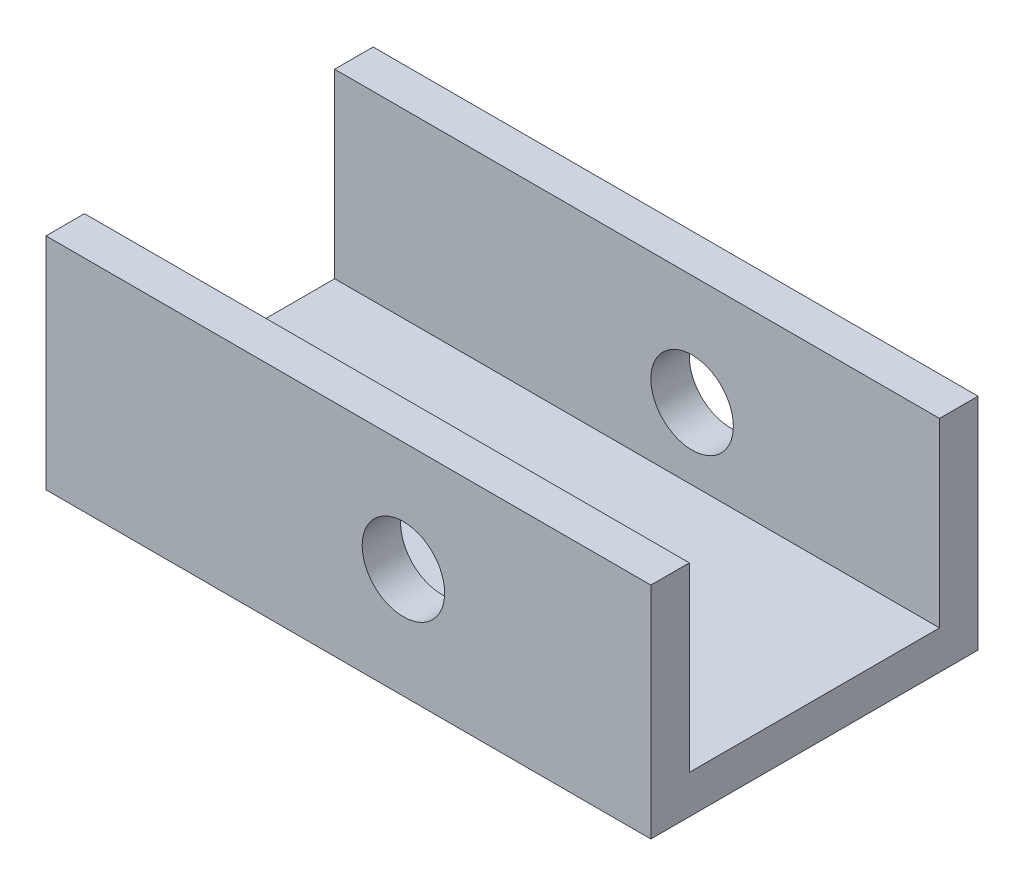
ISO-10303-21;
HEADER;
FILE_DESCRIPTION(('STEP AP214'),'2;1');
FILE_NAME('part.step','',(''),(''),'','','');
FILE_SCHEMA(('AUTOMOTIVE_DESIGN { 1 0 10303 214 1 1 1 1 }'));
ENDSEC;
DATA;
#1=APPLICATION_CONTEXT('core data for automotive mechanical design processes');
#2=APPLICATION_PROTOCOL_DEFINITION('international standard','automotive_design',2000,#1);
#3=PRODUCT_CONTEXT('',#1,'mechanical');
#4=PRODUCT('Part','Part','',(#3));
#5=PRODUCT_RELATED_PRODUCT_CATEGORY('part','',(#4));
#6=PRODUCT_DEFINITION_FORMATION('','',#4);
#7=PRODUCT_DEFINITION_CONTEXT('part definition',#1,'design');
#8=PRODUCT_DEFINITION('design','',#6,#7);
#9=PRODUCT_DEFINITION_SHAPE('','',#8);
#10=(LENGTH_UNIT() NAMED_UNIT(*) SI_UNIT(.MILLI.,.METRE.));
#11=(NAMED_UNIT(*) PLANE_ANGLE_UNIT() SI_UNIT($,.RADIAN.));
#12=(NAMED_UNIT(*) SI_UNIT($,.STERADIAN.) SOLID_ANGLE_UNIT());
#13=UNCERTAINTY_MEASURE_WITH_UNIT(LENGTH_MEASURE(1.E-05),#10,'distance_accuracy_value','');
#14=(GEOMETRIC_REPRESENTATION_CONTEXT(3) GLOBAL_UNCERTAINTY_ASSIGNED_CONTEXT((#13)) GLOBAL_UNIT_ASSIGNED_CONTEXT((#10,
#11,#12)) REPRESENTATION_CONTEXT('',''));
#15=CARTESIAN_POINT('',(0.,0.,0.));
#16=DIRECTION('',(0.,0.,1.));
#17=DIRECTION('',(1.,0.,0.));
#18=AXIS2_PLACEMENT_3D('',#15,#16,#17);
#19=CARTESIAN_POINT('',(0.,1.4,0.));
#20=DIRECTION('',(0.,1.,0.));
#21=DIRECTION('',(0.,0.,1.));
#22=AXIS2_PLACEMENT_3D('',#19,#20,#21);
#23=PLANE('',#22);
#24=DIRECTION('',(0.,0.,-1.));
#25=VECTOR('',#24,1.);
#26=CARTESIAN_POINT('',(0.,1.4,0.));
#27=LINE('',#26,#25);
#28=CARTESIAN_POINT('',(0.,1.4,-1.4));
#29=VERTEX_POINT('',#28);
#30=CARTESIAN_POINT('',(0.,1.4,-10.5));
#31=VERTEX_POINT('',#30);
#32=EDGE_CURVE('E57',#29,#31,#27,.T.);
#33=ORIENTED_EDGE('',*,*,#32,.F.);
#34=DIRECTION('',(1.,0.,0.));
#35=VECTOR('',#34,1.);
#36=CARTESIAN_POINT('',(0.,1.4,-1.4));
#37=LINE('',#36,#35);
#38=CARTESIAN_POINT('',(22.,1.4,-1.4));
#39=VERTEX_POINT('',#38);
#40=EDGE_CURVE('E61',#29,#39,#37,.T.);
#41=ORIENTED_EDGE('',*,*,#40,.T.);
#42=DIRECTION('',(0.,0.,-1.));
#43=VECTOR('',#42,1.);
#44=CARTESIAN_POINT('',(22.,1.4,0.));
#45=LINE('',#44,#43);
#46=CARTESIAN_POINT('',(22.,1.4,-10.5));
#47=VERTEX_POINT('',#46);
#48=EDGE_CURVE('E128',#39,#47,#45,.T.);
#49=ORIENTED_EDGE('',*,*,#48,.T.);
#50=DIRECTION('',(-1.,0.,0.));
#51=VECTOR('',#50,1.);
#52=CARTESIAN_POINT('',(0.,1.4,-10.5));
#53=LINE('',#52,#51);
#54=EDGE_CURVE('E151',#47,#31,#53,.T.);
#55=ORIENTED_EDGE('',*,*,#54,.T.);
#56=EDGE_LOOP('',(#33,#41,#49,#55));
#57=FACE_BOUND('',#56,.T.);
#58=ADVANCED_FACE('F41',(#57),#23,.T.);
#59=CARTESIAN_POINT('',(0.,1.4,0.));
#60=DIRECTION('',(-1.,0.,0.));
#61=DIRECTION('',(0.,0.,1.));
#62=AXIS2_PLACEMENT_3D('',#59,#60,#61);
#63=PLANE('',#62);
#64=DIRECTION('',(0.,-1.,0.));
#65=VECTOR('',#64,1.);
#66=CARTESIAN_POINT('',(0.,1.4,0.));
#67=LINE('',#66,#65);
#68=CARTESIAN_POINT('',(0.,8.,0.));
#69=VERTEX_POINT('',#68);
#70=CARTESIAN_POINT('',(0.,0.,0.));
#71=VERTEX_POINT('',#70);
#72=EDGE_CURVE('E11',#69,#71,#67,.T.);
#73=ORIENTED_EDGE('',*,*,#72,.F.);
#74=DIRECTION('',(0.,0.,-1.));
#75=VECTOR('',#74,1.);
#76=CARTESIAN_POINT('',(0.,8.,0.));
#77=LINE('',#76,#75);
#78=CARTESIAN_POINT('',(0.,8.,-1.4));
#79=VERTEX_POINT('',#78);
#80=EDGE_CURVE('E114',#69,#79,#77,.T.);
#81=ORIENTED_EDGE('',*,*,#80,.T.);
#82=DIRECTION('',(0.,-1.,0.));
#83=VECTOR('',#82,1.);
#84=CARTESIAN_POINT('',(0.,8.,-1.4));
#85=LINE('',#84,#83);
#86=EDGE_CURVE('E110',#79,#29,#85,.T.);
#87=ORIENTED_EDGE('',*,*,#86,.T.);
#88=ORIENTED_EDGE('',*,*,#32,.T.);
#89=DIRECTION('',(0.,-1.,0.));
#90=VECTOR('',#89,1.);
#91=CARTESIAN_POINT('',(0.,8.,-10.5));
#92=LINE('',#91,#90);
#93=CARTESIAN_POINT('',(0.,8.,-10.5));
#94=VERTEX_POINT('',#93);
#95=EDGE_CURVE('E146',#94,#31,#92,.T.);
#96=ORIENTED_EDGE('',*,*,#95,.F.);
#97=DIRECTION('',(0.,0.,-1.));
#98=VECTOR('',#97,1.);
#99=CARTESIAN_POINT('',(0.,8.,0.));
#100=LINE('',#99,#98);
#101=CARTESIAN_POINT('',(0.,8.,-11.9));
#102=VERTEX_POINT('',#101);
#103=EDGE_CURVE('E143',#94,#102,#100,.T.);
#104=ORIENTED_EDGE('',*,*,#103,.T.);
#105=DIRECTION('',(0.,-1.,0.));
#106=VECTOR('',#105,1.);
#107=CARTESIAN_POINT('',(0.,1.4,-11.9));
#108=LINE('',#107,#106);
#109=CARTESIAN_POINT('',(0.,0.,-11.9));
#110=VERTEX_POINT('',#109);
#111=EDGE_CURVE('E157',#102,#110,#108,.T.);
#112=ORIENTED_EDGE('',*,*,#111,.T.);
#113=DIRECTION('',(0.,0.,-1.));
#114=VECTOR('',#113,1.);
#115=CARTESIAN_POINT('',(0.,0.,0.));
#116=LINE('',#115,#114);
#117=EDGE_CURVE('E153',#71,#110,#116,.T.);
#118=ORIENTED_EDGE('',*,*,#117,.F.);
#119=EDGE_LOOP('',(#73,#81,#87,#88,#96,#104,#112,#118));
#120=FACE_BOUND('',#119,.T.);
#121=ADVANCED_FACE('F43',(#120),#63,.T.);
#122=CARTESIAN_POINT('',(0.,1.4,0.));
#123=DIRECTION('',(0.,0.,-1.));
#124=DIRECTION('',(-1.,0.,0.));
#125=AXIS2_PLACEMENT_3D('',#122,#123,#124);
#126=PLANE('',#125);
#127=CARTESIAN_POINT('',(13.,4.,0.));
#128=DIRECTION('',(0.,0.,-1.));
#129=DIRECTION('',(-1.,0.,0.));
#130=AXIS2_PLACEMENT_3D('',#127,#128,#129);
#131=CIRCLE('',#130,1.5);
#132=CARTESIAN_POINT('',(11.5,4.,0.));
#133=VERTEX_POINT('',#132);
#134=EDGE_CURVE('E124',#133,#133,#131,.T.);
#135=ORIENTED_EDGE('',*,*,#134,.T.);
#136=EDGE_LOOP('',(#135));
#137=FACE_BOUND('',#136,.T.);
#138=DIRECTION('',(1.,0.,0.));
#139=VECTOR('',#138,1.);
#140=CARTESIAN_POINT('',(0.,0.,0.));
#141=LINE('',#140,#139);
#142=CARTESIAN_POINT('',(22.,0.,0.));
#143=VERTEX_POINT('',#142);
#144=EDGE_CURVE('E159',#71,#143,#141,.T.);
#145=ORIENTED_EDGE('',*,*,#144,.T.);
#146=DIRECTION('',(0.,-1.,0.));
#147=VECTOR('',#146,1.);
#148=CARTESIAN_POINT('',(22.,1.4,0.));
#149=LINE('',#148,#147);
#150=CARTESIAN_POINT('',(22.,8.,0.));
#151=VERTEX_POINT('',#150);
#152=EDGE_CURVE('E50',#151,#143,#149,.T.);
#153=ORIENTED_EDGE('',*,*,#152,.F.);
#154=DIRECTION('',(1.,0.,0.));
#155=VECTOR('',#154,1.);
#156=CARTESIAN_POINT('',(0.,8.,0.));
#157=LINE('',#156,#155);
#158=EDGE_CURVE('E121',#69,#151,#157,.T.);
#159=ORIENTED_EDGE('',*,*,#158,.F.);
#160=ORIENTED_EDGE('',*,*,#72,.T.);
#161=EDGE_LOOP('',(#145,#153,#159,#160));
#162=FACE_BOUND('',#161,.T.);
#163=ADVANCED_FACE('F193',(#137,#162),#126,.F.);
#164=CARTESIAN_POINT('',(22.,1.4,0.));
#165=DIRECTION('',(-1.,0.,0.));
#166=DIRECTION('',(0.,0.,1.));
#167=AXIS2_PLACEMENT_3D('',#164,#165,#166);
#168=PLANE('',#167);
#169=DIRECTION('',(0.,0.,-1.));
#170=VECTOR('',#169,1.);
#171=CARTESIAN_POINT('',(22.,0.,0.));
#172=LINE('',#171,#170);
#173=CARTESIAN_POINT('',(22.,0.,-11.9));
#174=VERTEX_POINT('',#173);
#175=EDGE_CURVE('E161',#143,#174,#172,.T.);
#176=ORIENTED_EDGE('',*,*,#175,.T.);
#177=DIRECTION('',(0.,-1.,0.));
#178=VECTOR('',#177,1.);
#179=CARTESIAN_POINT('',(22.,1.4,-11.9));
#180=LINE('',#179,#178);
#181=CARTESIAN_POINT('',(22.,8.,-11.9));
#182=VERTEX_POINT('',#181);
#183=EDGE_CURVE('E167',#182,#174,#180,.T.);
#184=ORIENTED_EDGE('',*,*,#183,.F.);
#185=DIRECTION('',(0.,0.,-1.));
#186=VECTOR('',#185,1.);
#187=CARTESIAN_POINT('',(22.,8.,0.));
#188=LINE('',#187,#186);
#189=CARTESIAN_POINT('',(22.,8.,-10.5));
#190=VERTEX_POINT('',#189);
#191=EDGE_CURVE('E137',#190,#182,#188,.T.);
#192=ORIENTED_EDGE('',*,*,#191,.F.);
#193=DIRECTION('',(0.,-1.,0.));
#194=VECTOR('',#193,1.);
#195=CARTESIAN_POINT('',(22.,8.,-10.5));
#196=LINE('',#195,#194);
#197=EDGE_CURVE('E149',#190,#47,#196,.T.);
#198=ORIENTED_EDGE('',*,*,#197,.T.);
#199=ORIENTED_EDGE('',*,*,#48,.F.);
#200=DIRECTION('',(0.,-1.,0.));
#201=VECTOR('',#200,1.);
#202=CARTESIAN_POINT('',(22.,8.,-1.4));
#203=LINE('',#202,#201);
#204=CARTESIAN_POINT('',(22.,8.,-1.4));
#205=VERTEX_POINT('',#204);
#206=EDGE_CURVE('E108',#205,#39,#203,.T.);
#207=ORIENTED_EDGE('',*,*,#206,.F.);
#208=DIRECTION('',(0.,0.,-1.));
#209=VECTOR('',#208,1.);
#210=CARTESIAN_POINT('',(22.,8.,0.));
#211=LINE('',#210,#209);
#212=EDGE_CURVE('E115',#151,#205,#211,.T.);
#213=ORIENTED_EDGE('',*,*,#212,.F.);
#214=ORIENTED_EDGE('',*,*,#152,.T.);
#215=EDGE_LOOP('',(#176,#184,#192,#198,#199,#207,#213,#214));
#216=FACE_BOUND('',#215,.T.);
#217=ADVANCED_FACE('F126',(#216),#168,.F.);
#218=CARTESIAN_POINT('',(0.,1.4,-11.9));
#219=DIRECTION('',(0.,0.,-1.));
#220=DIRECTION('',(-1.,0.,0.));
#221=AXIS2_PLACEMENT_3D('',#218,#219,#220);
#222=PLANE('',#221);
#223=CARTESIAN_POINT('',(13.,4.,-11.9));
#224=DIRECTION('',(0.,0.,1.));
#225=DIRECTION('',(1.,0.,0.));
#226=AXIS2_PLACEMENT_3D('',#223,#224,#225);
#227=CIRCLE('',#226,1.5);
#228=CARTESIAN_POINT('',(14.5,4.,-11.9));
#229=VERTEX_POINT('',#228);
#230=EDGE_CURVE('E216',#229,#229,#227,.T.);
#231=ORIENTED_EDGE('',*,*,#230,.T.);
#232=EDGE_LOOP('',(#231));
#233=FACE_BOUND('',#232,.T.);
#234=DIRECTION('',(1.,0.,0.));
#235=VECTOR('',#234,1.);
#236=CARTESIAN_POINT('',(0.,0.,-11.9));
#237=LINE('',#236,#235);
#238=EDGE_CURVE('E155',#110,#174,#237,.T.);
#239=ORIENTED_EDGE('',*,*,#238,.F.);
#240=ORIENTED_EDGE('',*,*,#111,.F.);
#241=DIRECTION('',(1.,0.,0.));
#242=VECTOR('',#241,1.);
#243=CARTESIAN_POINT('',(0.,8.,-11.9));
#244=LINE('',#243,#242);
#245=EDGE_CURVE('E140',#102,#182,#244,.T.);
#246=ORIENTED_EDGE('',*,*,#245,.T.);
#247=ORIENTED_EDGE('',*,*,#183,.T.);
#248=EDGE_LOOP('',(#239,#240,#246,#247));
#249=FACE_BOUND('',#248,.T.);
#250=ADVANCED_FACE('F178',(#233,#249),#222,.T.);
#251=CARTESIAN_POINT('',(0.,0.,0.));
#252=DIRECTION('',(0.,1.,0.));
#253=DIRECTION('',(0.,0.,1.));
#254=AXIS2_PLACEMENT_3D('',#251,#252,#253);
#255=PLANE('',#254);
#256=ORIENTED_EDGE('',*,*,#117,.T.);
#257=ORIENTED_EDGE('',*,*,#238,.T.);
#258=ORIENTED_EDGE('',*,*,#175,.F.);
#259=ORIENTED_EDGE('',*,*,#144,.F.);
#260=EDGE_LOOP('',(#256,#257,#258,#259));
#261=FACE_BOUND('',#260,.T.);
#262=ADVANCED_FACE('F174',(#261),#255,.F.);
#263=CARTESIAN_POINT('',(0.,8.,-10.5));
#264=DIRECTION('',(0.,0.,-1.));
#265=DIRECTION('',(-1.,0.,0.));
#266=AXIS2_PLACEMENT_3D('',#263,#264,#265);
#267=PLANE('',#266);
#268=CARTESIAN_POINT('',(13.,4.,-10.5));
#269=DIRECTION('',(0.,0.,-1.));
#270=DIRECTION('',(-1.,0.,0.));
#271=AXIS2_PLACEMENT_3D('',#268,#269,#270);
#272=CIRCLE('',#271,1.5);
#273=CARTESIAN_POINT('',(11.5,4.,-10.5));
#274=VERTEX_POINT('',#273);
#275=EDGE_CURVE('E213',#274,#274,#272,.T.);
#276=ORIENTED_EDGE('',*,*,#275,.T.);
#277=EDGE_LOOP('',(#276));
#278=FACE_BOUND('',#277,.T.);
#279=ORIENTED_EDGE('',*,*,#54,.F.);
#280=ORIENTED_EDGE('',*,*,#197,.F.);
#281=DIRECTION('',(1.,0.,0.));
#282=VECTOR('',#281,1.);
#283=CARTESIAN_POINT('',(0.,8.,-10.5));
#284=LINE('',#283,#282);
#285=EDGE_CURVE('E130',#94,#190,#284,.T.);
#286=ORIENTED_EDGE('',*,*,#285,.F.);
#287=ORIENTED_EDGE('',*,*,#95,.T.);
#288=EDGE_LOOP('',(#279,#280,#286,#287));
#289=FACE_BOUND('',#288,.T.);
#290=ADVANCED_FACE('F187',(#278,#289),#267,.F.);
#291=CARTESIAN_POINT('',(0.,8.,0.));
#292=DIRECTION('',(0.,1.,0.));
#293=DIRECTION('',(0.,0.,1.));
#294=AXIS2_PLACEMENT_3D('',#291,#292,#293);
#295=PLANE('',#294);
#296=ORIENTED_EDGE('',*,*,#285,.T.);
#297=ORIENTED_EDGE('',*,*,#191,.T.);
#298=ORIENTED_EDGE('',*,*,#245,.F.);
#299=ORIENTED_EDGE('',*,*,#103,.F.);
#300=EDGE_LOOP('',(#296,#297,#298,#299));
#301=FACE_BOUND('',#300,.T.);
#302=ADVANCED_FACE('F181',(#301),#295,.T.);
#303=CARTESIAN_POINT('',(0.,8.,-1.4));
#304=DIRECTION('',(0.,0.,1.));
#305=DIRECTION('',(1.,0.,0.));
#306=AXIS2_PLACEMENT_3D('',#303,#304,#305);
#307=PLANE('',#306);
#308=CARTESIAN_POINT('',(13.,4.,-1.4));
#309=DIRECTION('',(0.,0.,1.));
#310=DIRECTION('',(1.,0.,0.));
#311=AXIS2_PLACEMENT_3D('',#308,#309,#310);
#312=CIRCLE('',#311,1.5);
#313=CARTESIAN_POINT('',(14.5,4.,-1.4));
#314=VERTEX_POINT('',#313);
#315=EDGE_CURVE('E45',#314,#314,#312,.T.);
#316=ORIENTED_EDGE('',*,*,#315,.T.);
#317=EDGE_LOOP('',(#316));
#318=FACE_BOUND('',#317,.T.);
#319=ORIENTED_EDGE('',*,*,#40,.F.);
#320=ORIENTED_EDGE('',*,*,#86,.F.);
#321=DIRECTION('',(-1.,0.,0.));
#322=VECTOR('',#321,1.);
#323=CARTESIAN_POINT('',(0.,8.,-1.4));
#324=LINE('',#323,#322);
#325=EDGE_CURVE('E104',#205,#79,#324,.T.);
#326=ORIENTED_EDGE('',*,*,#325,.F.);
#327=ORIENTED_EDGE('',*,*,#206,.T.);
#328=EDGE_LOOP('',(#319,#320,#326,#327));
#329=FACE_BOUND('',#328,.T.);
#330=ADVANCED_FACE('F106',(#318,#329),#307,.F.);
#331=CARTESIAN_POINT('',(0.,8.,0.));
#332=DIRECTION('',(0.,1.,0.));
#333=DIRECTION('',(0.,0.,1.));
#334=AXIS2_PLACEMENT_3D('',#331,#332,#333);
#335=PLANE('',#334);
#336=ORIENTED_EDGE('',*,*,#212,.T.);
#337=ORIENTED_EDGE('',*,*,#325,.T.);
#338=ORIENTED_EDGE('',*,*,#80,.F.);
#339=ORIENTED_EDGE('',*,*,#158,.T.);
#340=EDGE_LOOP('',(#336,#337,#338,#339));
#341=FACE_BOUND('',#340,.T.);
#342=ADVANCED_FACE('F119',(#341),#335,.T.);
#343=CARTESIAN_POINT('',(13.,4.,-11.9));
#344=DIRECTION('',(0.,0.,1.));
#345=DIRECTION('',(1.,0.,0.));
#346=AXIS2_PLACEMENT_3D('',#343,#344,#345);
#347=CYLINDRICAL_SURFACE('',#346,1.5);
#348=ORIENTED_EDGE('',*,*,#315,.F.);
#349=EDGE_LOOP('',(#348));
#350=FACE_BOUND('',#349,.T.);
#351=ORIENTED_EDGE('',*,*,#134,.F.);
#352=EDGE_LOOP('',(#351));
#353=FACE_BOUND('',#352,.T.);
#354=ADVANCED_FACE('F223',(#350,#353),#347,.F.);
#355=ORIENTED_EDGE('',*,*,#230,.F.);
#356=EDGE_LOOP('',(#355));
#357=FACE_BOUND('',#356,.T.);
#358=ORIENTED_EDGE('',*,*,#275,.F.);
#359=EDGE_LOOP('',(#358));
#360=FACE_BOUND('',#359,.T.);
#361=ADVANCED_FACE('F226',(#357,#360),#347,.F.);
#362=CLOSED_SHELL('',(#58,#121,#163,#217,#250,#262,#290,#302,#330,#342,#354,#361));
#363=MANIFOLD_SOLID_BREP('B2',#362);
#364=ADVANCED_BREP_SHAPE_REPRESENTATION('',(#18,#363),#14);
#365=SHAPE_DEFINITION_REPRESENTATION(#9,#364);
ENDSEC;
END-ISO-10303-21;
